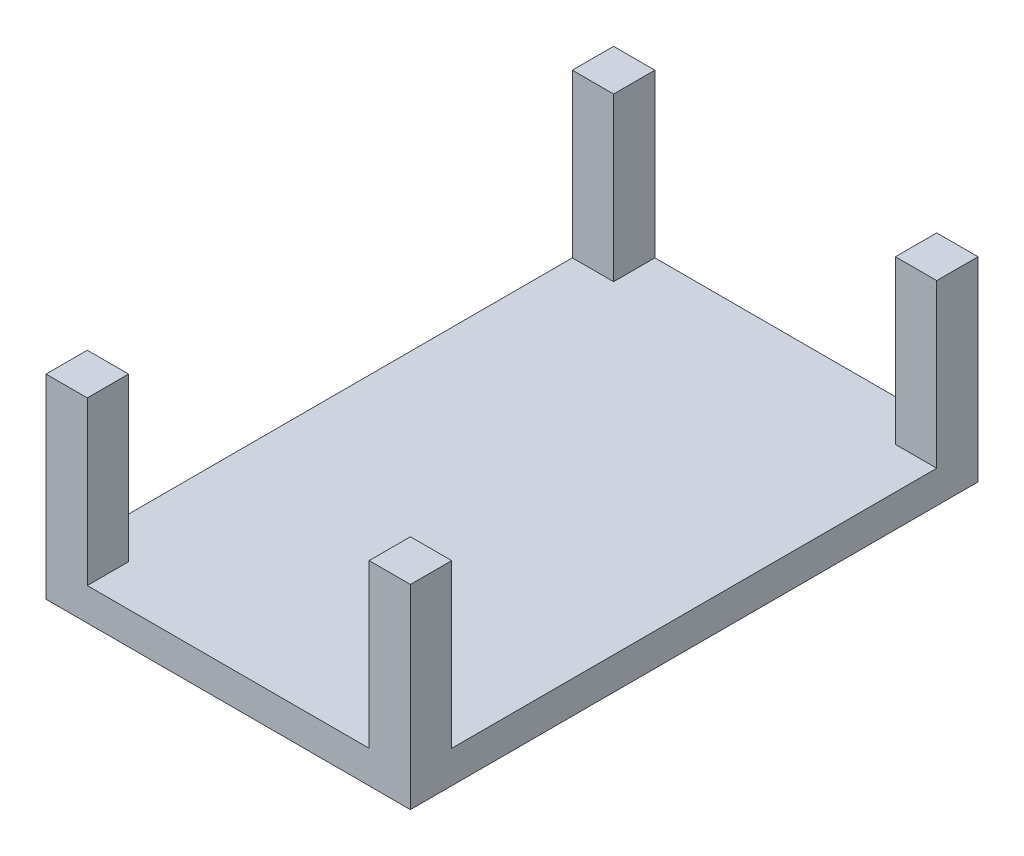
ISO-10303-21;
HEADER;
FILE_DESCRIPTION(('STEP AP214'),'2;1');
FILE_NAME('part.step','',(''),(''),'','','');
FILE_SCHEMA(('AUTOMOTIVE_DESIGN { 1 0 10303 214 1 1 1 1 }'));
ENDSEC;
DATA;
#1=APPLICATION_CONTEXT('core data for automotive mechanical design processes');
#2=APPLICATION_PROTOCOL_DEFINITION('international standard','automotive_design',2000,#1);
#3=PRODUCT_CONTEXT('',#1,'mechanical');
#4=PRODUCT('Part','Part','',(#3));
#5=PRODUCT_RELATED_PRODUCT_CATEGORY('part','',(#4));
#6=PRODUCT_DEFINITION_FORMATION('','',#4);
#7=PRODUCT_DEFINITION_CONTEXT('part definition',#1,'design');
#8=PRODUCT_DEFINITION('design','',#6,#7);
#9=PRODUCT_DEFINITION_SHAPE('','',#8);
#10=(LENGTH_UNIT() NAMED_UNIT(*) SI_UNIT(.MILLI.,.METRE.));
#11=(NAMED_UNIT(*) PLANE_ANGLE_UNIT() SI_UNIT($,.RADIAN.));
#12=(NAMED_UNIT(*) SI_UNIT($,.STERADIAN.) SOLID_ANGLE_UNIT());
#13=UNCERTAINTY_MEASURE_WITH_UNIT(LENGTH_MEASURE(1.E-05),#10,'distance_accuracy_value','');
#14=(GEOMETRIC_REPRESENTATION_CONTEXT(3) GLOBAL_UNCERTAINTY_ASSIGNED_CONTEXT((#13)) GLOBAL_UNIT_ASSIGNED_CONTEXT((#10,
#11,#12)) REPRESENTATION_CONTEXT('',''));
#15=CARTESIAN_POINT('',(0.,0.,0.));
#16=DIRECTION('',(0.,0.,1.));
#17=DIRECTION('',(1.,0.,0.));
#18=AXIS2_PLACEMENT_3D('',#15,#16,#17);
#19=CARTESIAN_POINT('',(0.,-200.,0.));
#20=DIRECTION('',(0.,-1.,0.));
#21=DIRECTION('',(0.,0.,-1.));
#22=AXIS2_PLACEMENT_3D('',#19,#20,#21);
#23=PLANE('',#22);
#24=DIRECTION('',(-1.,0.,0.));
#25=VECTOR('',#24,1.);
#26=CARTESIAN_POINT('',(0.,-200.,298.4));
#27=LINE('',#26,#25);
#28=CARTESIAN_POINT('',(0.,-200.,298.4));
#29=VERTEX_POINT('',#28);
#30=CARTESIAN_POINT('',(-50.8,-200.,298.4));
#31=VERTEX_POINT('',#30);
#32=EDGE_CURVE('E160',#29,#31,#27,.T.);
#33=ORIENTED_EDGE('',*,*,#32,.F.);
#34=DIRECTION('',(0.,0.,-1.));
#35=VECTOR('',#34,1.);
#36=CARTESIAN_POINT('',(0.,-200.,0.));
#37=LINE('',#36,#35);
#38=CARTESIAN_POINT('',(0.,-200.,-298.4));
#39=VERTEX_POINT('',#38);
#40=EDGE_CURVE('E256',#29,#39,#37,.T.);
#41=ORIENTED_EDGE('',*,*,#40,.T.);
#42=DIRECTION('',(-1.,0.,0.));
#43=VECTOR('',#42,1.);
#44=CARTESIAN_POINT('',(3.26073376523766E-13,-200.,-298.4));
#45=LINE('',#44,#43);
#46=CARTESIAN_POINT('',(-50.8,-200.,-298.4));
#47=VERTEX_POINT('',#46);
#48=EDGE_CURVE('E222',#39,#47,#45,.T.);
#49=ORIENTED_EDGE('',*,*,#48,.T.);
#50=DIRECTION('',(0.,0.,1.));
#51=VECTOR('',#50,1.);
#52=CARTESIAN_POINT('',(-50.8000000000002,-200.,0.));
#53=LINE('',#52,#51);
#54=CARTESIAN_POINT('',(-50.8,-200.,-349.2));
#55=VERTEX_POINT('',#54);
#56=EDGE_CURVE('E214',#55,#47,#53,.T.);
#57=ORIENTED_EDGE('',*,*,#56,.F.);
#58=DIRECTION('',(1.,0.,0.));
#59=VECTOR('',#58,1.);
#60=CARTESIAN_POINT('',(0.,-200.,-349.2));
#61=LINE('',#60,#59);
#62=CARTESIAN_POINT('',(-397.6,-200.,-349.2));
#63=VERTEX_POINT('',#62);
#64=EDGE_CURVE('E259',#63,#55,#61,.T.);
#65=ORIENTED_EDGE('',*,*,#64,.F.);
#66=DIRECTION('',(0.,0.,1.));
#67=VECTOR('',#66,1.);
#68=CARTESIAN_POINT('',(-397.6,-200.,-4.34473104912365E-13));
#69=LINE('',#68,#67);
#70=CARTESIAN_POINT('',(-397.6,-200.,-298.4));
#71=VERTEX_POINT('',#70);
#72=EDGE_CURVE('E246',#63,#71,#69,.T.);
#73=ORIENTED_EDGE('',*,*,#72,.T.);
#74=DIRECTION('',(-1.,0.,0.));
#75=VECTOR('',#74,1.);
#76=CARTESIAN_POINT('',(0.,-200.,-298.4));
#77=LINE('',#76,#75);
#78=CARTESIAN_POINT('',(-448.4,-200.,-298.4));
#79=VERTEX_POINT('',#78);
#80=EDGE_CURVE('E11',#71,#79,#77,.T.);
#81=ORIENTED_EDGE('',*,*,#80,.T.);
#82=DIRECTION('',(0.,0.,1.));
#83=VECTOR('',#82,1.);
#84=CARTESIAN_POINT('',(-448.4,-200.,0.));
#85=LINE('',#84,#83);
#86=CARTESIAN_POINT('',(-448.4,-200.,298.4));
#87=VERTEX_POINT('',#86);
#88=EDGE_CURVE('E264',#79,#87,#85,.T.);
#89=ORIENTED_EDGE('',*,*,#88,.T.);
#90=DIRECTION('',(-1.,0.,0.));
#91=VECTOR('',#90,1.);
#92=CARTESIAN_POINT('',(-3.26073376523767E-13,-200.,298.4));
#93=LINE('',#92,#91);
#94=CARTESIAN_POINT('',(-397.6,-200.,298.4));
#95=VERTEX_POINT('',#94);
#96=EDGE_CURVE('E50',#95,#87,#93,.T.);
#97=ORIENTED_EDGE('',*,*,#96,.F.);
#98=DIRECTION('',(0.,0.,1.));
#99=VECTOR('',#98,1.);
#100=CARTESIAN_POINT('',(-397.6,-200.,0.));
#101=LINE('',#100,#99);
#102=CARTESIAN_POINT('',(-397.6,-200.,349.2));
#103=VERTEX_POINT('',#102);
#104=EDGE_CURVE('E288',#95,#103,#101,.T.);
#105=ORIENTED_EDGE('',*,*,#104,.T.);
#106=DIRECTION('',(1.,0.,0.));
#107=VECTOR('',#106,1.);
#108=CARTESIAN_POINT('',(0.,-200.,349.2));
#109=LINE('',#108,#107);
#110=CARTESIAN_POINT('',(-50.8,-200.,349.2));
#111=VERTEX_POINT('',#110);
#112=EDGE_CURVE('E267',#103,#111,#109,.T.);
#113=ORIENTED_EDGE('',*,*,#112,.T.);
#114=DIRECTION('',(0.,0.,-1.));
#115=VECTOR('',#114,1.);
#116=CARTESIAN_POINT('',(-50.8,-200.,0.));
#117=LINE('',#116,#115);
#118=EDGE_CURVE('E192',#111,#31,#117,.T.);
#119=ORIENTED_EDGE('',*,*,#118,.T.);
#120=EDGE_LOOP('',(#33,#41,#49,#57,#65,#73,#81,#89,#97,#105,#113,#119));
#121=FACE_BOUND('',#120,.T.);
#122=ADVANCED_FACE('F41',(#121),#23,.F.);
#123=CARTESIAN_POINT('',(-397.6,-240.,0.));
#124=DIRECTION('',(-1.,0.,0.));
#125=DIRECTION('',(0.,0.,1.));
#126=AXIS2_PLACEMENT_3D('',#123,#124,#125);
#127=PLANE('',#126);
#128=ORIENTED_EDGE('',*,*,#104,.F.);
#129=DIRECTION('',(0.,1.,0.));
#130=VECTOR('',#129,1.);
#131=CARTESIAN_POINT('',(-397.6,-240.,298.4));
#132=LINE('',#131,#130);
#133=CARTESIAN_POINT('',(-397.6,0.,298.4));
#134=VERTEX_POINT('',#133);
#135=EDGE_CURVE('E300',#95,#134,#132,.T.);
#136=ORIENTED_EDGE('',*,*,#135,.T.);
#137=DIRECTION('',(0.,0.,1.));
#138=VECTOR('',#137,1.);
#139=CARTESIAN_POINT('',(-397.6,0.,0.));
#140=LINE('',#139,#138);
#141=CARTESIAN_POINT('',(-397.6,0.,349.2));
#142=VERTEX_POINT('',#141);
#143=EDGE_CURVE('E292',#134,#142,#140,.T.);
#144=ORIENTED_EDGE('',*,*,#143,.T.);
#145=DIRECTION('',(0.,1.,0.));
#146=VECTOR('',#145,1.);
#147=CARTESIAN_POINT('',(-397.6,-240.,349.2));
#148=LINE('',#147,#146);
#149=EDGE_CURVE('E315',#103,#142,#148,.T.);
#150=ORIENTED_EDGE('',*,*,#149,.F.);
#151=EDGE_LOOP('',(#128,#136,#144,#150));
#152=FACE_BOUND('',#151,.T.);
#153=ADVANCED_FACE('F43',(#152),#127,.F.);
#154=CARTESIAN_POINT('',(-3.26073376523767E-13,-240.,298.4));
#155=DIRECTION('',(0.,0.,-1.));
#156=DIRECTION('',(-1.,0.,0.));
#157=AXIS2_PLACEMENT_3D('',#154,#155,#156);
#158=PLANE('',#157);
#159=ORIENTED_EDGE('',*,*,#135,.F.);
#160=ORIENTED_EDGE('',*,*,#96,.T.);
#161=DIRECTION('',(0.,1.,0.));
#162=VECTOR('',#161,1.);
#163=CARTESIAN_POINT('',(-448.4,-240.,298.4));
#164=LINE('',#163,#162);
#165=CARTESIAN_POINT('',(-448.4,0.,298.4));
#166=VERTEX_POINT('',#165);
#167=EDGE_CURVE('E321',#87,#166,#164,.T.);
#168=ORIENTED_EDGE('',*,*,#167,.T.);
#169=DIRECTION('',(-1.,0.,0.));
#170=VECTOR('',#169,1.);
#171=CARTESIAN_POINT('',(-3.26073376523767E-13,0.,298.4));
#172=LINE('',#171,#170);
#173=EDGE_CURVE('E304',#134,#166,#172,.T.);
#174=ORIENTED_EDGE('',*,*,#173,.F.);
#175=EDGE_LOOP('',(#159,#160,#168,#174));
#176=FACE_BOUND('',#175,.T.);
#177=ADVANCED_FACE('F331',(#176),#158,.T.);
#178=CARTESIAN_POINT('',(0.,-240.,349.2));
#179=DIRECTION('',(0.,0.,1.));
#180=DIRECTION('',(1.,0.,0.));
#181=AXIS2_PLACEMENT_3D('',#178,#179,#180);
#182=PLANE('',#181);
#183=DIRECTION('',(1.,0.,0.));
#184=VECTOR('',#183,1.);
#185=CARTESIAN_POINT('',(0.,-240.,349.2));
#186=LINE('',#185,#184);
#187=CARTESIAN_POINT('',(-448.4,-240.,349.2));
#188=VERTEX_POINT('',#187);
#189=CARTESIAN_POINT('',(0.,-240.,349.2));
#190=VERTEX_POINT('',#189);
#191=EDGE_CURVE('E296',#188,#190,#186,.T.);
#192=ORIENTED_EDGE('',*,*,#191,.T.);
#193=DIRECTION('',(0.,-1.,0.));
#194=VECTOR('',#193,1.);
#195=CARTESIAN_POINT('',(0.,-200.,349.2));
#196=LINE('',#195,#194);
#197=CARTESIAN_POINT('',(0.,0.,349.2));
#198=VERTEX_POINT('',#197);
#199=EDGE_CURVE('E271',#198,#190,#196,.T.);
#200=ORIENTED_EDGE('',*,*,#199,.F.);
#201=DIRECTION('',(1.,0.,0.));
#202=VECTOR('',#201,1.);
#203=CARTESIAN_POINT('',(0.,0.,349.2));
#204=LINE('',#203,#202);
#205=CARTESIAN_POINT('',(-50.8,0.,349.2));
#206=VERTEX_POINT('',#205);
#207=EDGE_CURVE('E178',#206,#198,#204,.T.);
#208=ORIENTED_EDGE('',*,*,#207,.F.);
#209=DIRECTION('',(0.,1.,0.));
#210=VECTOR('',#209,1.);
#211=CARTESIAN_POINT('',(-50.8,-240.,349.2));
#212=LINE('',#211,#210);
#213=EDGE_CURVE('E163',#111,#206,#212,.T.);
#214=ORIENTED_EDGE('',*,*,#213,.F.);
#215=ORIENTED_EDGE('',*,*,#112,.F.);
#216=ORIENTED_EDGE('',*,*,#149,.T.);
#217=DIRECTION('',(1.,0.,0.));
#218=VECTOR('',#217,1.);
#219=CARTESIAN_POINT('',(0.,0.,349.2));
#220=LINE('',#219,#218);
#221=CARTESIAN_POINT('',(-448.4,0.,349.2));
#222=VERTEX_POINT('',#221);
#223=EDGE_CURVE('E297',#222,#142,#220,.T.);
#224=ORIENTED_EDGE('',*,*,#223,.F.);
#225=DIRECTION('',(0.,1.,0.));
#226=VECTOR('',#225,1.);
#227=CARTESIAN_POINT('',(-448.4,-240.,349.2));
#228=LINE('',#227,#226);
#229=EDGE_CURVE('E318',#188,#222,#228,.T.);
#230=ORIENTED_EDGE('',*,*,#229,.F.);
#231=EDGE_LOOP('',(#192,#200,#208,#214,#215,#216,#224,#230));
#232=FACE_BOUND('',#231,.T.);
#233=ADVANCED_FACE('F346',(#232),#182,.T.);
#234=CARTESIAN_POINT('',(-448.4,-240.,0.));
#235=DIRECTION('',(-1.,0.,0.));
#236=DIRECTION('',(0.,0.,1.));
#237=AXIS2_PLACEMENT_3D('',#234,#235,#236);
#238=PLANE('',#237);
#239=ORIENTED_EDGE('',*,*,#88,.F.);
#240=DIRECTION('',(0.,1.,0.));
#241=VECTOR('',#240,1.);
#242=CARTESIAN_POINT('',(-448.4,-240.,-298.4));
#243=LINE('',#242,#241);
#244=CARTESIAN_POINT('',(-448.4,0.,-298.4));
#245=VERTEX_POINT('',#244);
#246=EDGE_CURVE('E242',#79,#245,#243,.T.);
#247=ORIENTED_EDGE('',*,*,#246,.T.);
#248=DIRECTION('',(0.,0.,1.));
#249=VECTOR('',#248,1.);
#250=CARTESIAN_POINT('',(-448.4,0.,0.));
#251=LINE('',#250,#249);
#252=CARTESIAN_POINT('',(-448.4,0.,-349.2));
#253=VERTEX_POINT('',#252);
#254=EDGE_CURVE('E226',#253,#245,#251,.T.);
#255=ORIENTED_EDGE('',*,*,#254,.F.);
#256=DIRECTION('',(0.,-1.,0.));
#257=VECTOR('',#256,1.);
#258=CARTESIAN_POINT('',(-448.4,-200.,-349.2));
#259=LINE('',#258,#257);
#260=CARTESIAN_POINT('',(-448.4,-240.,-349.2));
#261=VERTEX_POINT('',#260);
#262=EDGE_CURVE('E280',#253,#261,#259,.T.);
#263=ORIENTED_EDGE('',*,*,#262,.T.);
#264=DIRECTION('',(0.,0.,1.));
#265=VECTOR('',#264,1.);
#266=CARTESIAN_POINT('',(-448.4,-240.,0.));
#267=LINE('',#266,#265);
#268=EDGE_CURVE('E293',#261,#188,#267,.T.);
#269=ORIENTED_EDGE('',*,*,#268,.T.);
#270=ORIENTED_EDGE('',*,*,#229,.T.);
#271=DIRECTION('',(0.,0.,1.));
#272=VECTOR('',#271,1.);
#273=CARTESIAN_POINT('',(-448.4,0.,0.));
#274=LINE('',#273,#272);
#275=EDGE_CURVE('E308',#166,#222,#274,.T.);
#276=ORIENTED_EDGE('',*,*,#275,.F.);
#277=ORIENTED_EDGE('',*,*,#167,.F.);
#278=EDGE_LOOP('',(#239,#247,#255,#263,#269,#270,#276,#277));
#279=FACE_BOUND('',#278,.T.);
#280=ADVANCED_FACE('F337',(#279),#238,.T.);
#281=CARTESIAN_POINT('',(0.,-240.,0.));
#282=DIRECTION('',(0.,1.,0.));
#283=DIRECTION('',(0.,0.,1.));
#284=AXIS2_PLACEMENT_3D('',#281,#282,#283);
#285=PLANE('',#284);
#286=DIRECTION('',(1.,0.,0.));
#287=VECTOR('',#286,1.);
#288=CARTESIAN_POINT('',(0.,-240.,-349.2));
#289=LINE('',#288,#287);
#290=CARTESIAN_POINT('',(0.,-240.,-349.2));
#291=VERTEX_POINT('',#290);
#292=EDGE_CURVE('E260',#261,#291,#289,.T.);
#293=ORIENTED_EDGE('',*,*,#292,.T.);
#294=DIRECTION('',(0.,0.,-1.));
#295=VECTOR('',#294,1.);
#296=CARTESIAN_POINT('',(0.,-240.,0.));
#297=LINE('',#296,#295);
#298=EDGE_CURVE('E255',#190,#291,#297,.T.);
#299=ORIENTED_EDGE('',*,*,#298,.F.);
#300=ORIENTED_EDGE('',*,*,#191,.F.);
#301=ORIENTED_EDGE('',*,*,#268,.F.);
#302=EDGE_LOOP('',(#293,#299,#300,#301));
#303=FACE_BOUND('',#302,.T.);
#304=ADVANCED_FACE('F397',(#303),#285,.F.);
#305=CARTESIAN_POINT('',(0.,0.,0.));
#306=DIRECTION('',(0.,1.,0.));
#307=DIRECTION('',(0.,0.,1.));
#308=AXIS2_PLACEMENT_3D('',#305,#306,#307);
#309=PLANE('',#308);
#310=ORIENTED_EDGE('',*,*,#143,.F.);
#311=ORIENTED_EDGE('',*,*,#173,.T.);
#312=ORIENTED_EDGE('',*,*,#275,.T.);
#313=ORIENTED_EDGE('',*,*,#223,.T.);
#314=EDGE_LOOP('',(#310,#311,#312,#313));
#315=FACE_BOUND('',#314,.T.);
#316=ADVANCED_FACE('F342',(#315),#309,.T.);
#317=CARTESIAN_POINT('',(0.,-200.,0.));
#318=DIRECTION('',(-1.,0.,0.));
#319=DIRECTION('',(0.,0.,1.));
#320=AXIS2_PLACEMENT_3D('',#317,#318,#319);
#321=PLANE('',#320);
#322=ORIENTED_EDGE('',*,*,#298,.T.);
#323=DIRECTION('',(0.,-1.,0.));
#324=VECTOR('',#323,1.);
#325=CARTESIAN_POINT('',(0.,-200.,-349.2));
#326=LINE('',#325,#324);
#327=CARTESIAN_POINT('',(0.,0.,-349.2));
#328=VERTEX_POINT('',#327);
#329=EDGE_CURVE('E284',#328,#291,#326,.T.);
#330=ORIENTED_EDGE('',*,*,#329,.F.);
#331=DIRECTION('',(0.,0.,-1.));
#332=VECTOR('',#331,1.);
#333=CARTESIAN_POINT('',(0.,0.,0.));
#334=LINE('',#333,#332);
#335=CARTESIAN_POINT('',(0.,0.,-298.4));
#336=VERTEX_POINT('',#335);
#337=EDGE_CURVE('E203',#336,#328,#334,.T.);
#338=ORIENTED_EDGE('',*,*,#337,.F.);
#339=DIRECTION('',(0.,1.,0.));
#340=VECTOR('',#339,1.);
#341=CARTESIAN_POINT('',(0.,-240.,-298.4));
#342=LINE('',#341,#340);
#343=EDGE_CURVE('E215',#39,#336,#342,.T.);
#344=ORIENTED_EDGE('',*,*,#343,.F.);
#345=ORIENTED_EDGE('',*,*,#40,.F.);
#346=DIRECTION('',(0.,1.,0.));
#347=VECTOR('',#346,1.);
#348=CARTESIAN_POINT('',(0.,-240.,298.4));
#349=LINE('',#348,#347);
#350=CARTESIAN_POINT('',(0.,0.,298.4));
#351=VERTEX_POINT('',#350);
#352=EDGE_CURVE('E185',#29,#351,#349,.T.);
#353=ORIENTED_EDGE('',*,*,#352,.T.);
#354=DIRECTION('',(0.,0.,-1.));
#355=VECTOR('',#354,1.);
#356=CARTESIAN_POINT('',(0.,0.,0.));
#357=LINE('',#356,#355);
#358=EDGE_CURVE('E164',#198,#351,#357,.T.);
#359=ORIENTED_EDGE('',*,*,#358,.F.);
#360=ORIENTED_EDGE('',*,*,#199,.T.);
#361=EDGE_LOOP('',(#322,#330,#338,#344,#345,#353,#359,#360));
#362=FACE_BOUND('',#361,.T.);
#363=ADVANCED_FACE('F348',(#362),#321,.F.);
#364=CARTESIAN_POINT('',(0.,-200.,-349.2));
#365=DIRECTION('',(0.,0.,-1.));
#366=DIRECTION('',(-1.,0.,0.));
#367=AXIS2_PLACEMENT_3D('',#364,#365,#366);
#368=PLANE('',#367);
#369=ORIENTED_EDGE('',*,*,#329,.T.);
#370=ORIENTED_EDGE('',*,*,#292,.F.);
#371=ORIENTED_EDGE('',*,*,#262,.F.);
#372=DIRECTION('',(1.,0.,0.));
#373=VECTOR('',#372,1.);
#374=CARTESIAN_POINT('',(0.,0.,-349.2));
#375=LINE('',#374,#373);
#376=CARTESIAN_POINT('',(-397.6,0.,-349.2));
#377=VERTEX_POINT('',#376);
#378=EDGE_CURVE('E238',#253,#377,#375,.T.);
#379=ORIENTED_EDGE('',*,*,#378,.T.);
#380=DIRECTION('',(0.,1.,0.));
#381=VECTOR('',#380,1.);
#382=CARTESIAN_POINT('',(-397.6,-240.,-349.2));
#383=LINE('',#382,#381);
#384=EDGE_CURVE('E243',#63,#377,#383,.T.);
#385=ORIENTED_EDGE('',*,*,#384,.F.);
#386=ORIENTED_EDGE('',*,*,#64,.T.);
#387=DIRECTION('',(0.,1.,0.));
#388=VECTOR('',#387,1.);
#389=CARTESIAN_POINT('',(-50.8,-240.,-349.2));
#390=LINE('',#389,#388);
#391=CARTESIAN_POINT('',(-50.8,0.,-349.2));
#392=VERTEX_POINT('',#391);
#393=EDGE_CURVE('E211',#55,#392,#390,.T.);
#394=ORIENTED_EDGE('',*,*,#393,.T.);
#395=DIRECTION('',(1.,0.,0.));
#396=VECTOR('',#395,1.);
#397=CARTESIAN_POINT('',(0.,0.,-349.2));
#398=LINE('',#397,#396);
#399=EDGE_CURVE('E207',#392,#328,#398,.T.);
#400=ORIENTED_EDGE('',*,*,#399,.T.);
#401=EDGE_LOOP('',(#369,#370,#371,#379,#385,#386,#394,#400));
#402=FACE_BOUND('',#401,.T.);
#403=ADVANCED_FACE('F364',(#402),#368,.T.);
#404=CARTESIAN_POINT('',(0.,-240.,-298.4));
#405=DIRECTION('',(0.,0.,1.));
#406=DIRECTION('',(1.,0.,0.));
#407=AXIS2_PLACEMENT_3D('',#404,#405,#406);
#408=PLANE('',#407);
#409=ORIENTED_EDGE('',*,*,#80,.F.);
#410=DIRECTION('',(0.,1.,0.));
#411=VECTOR('',#410,1.);
#412=CARTESIAN_POINT('',(-397.6,-240.,-298.4));
#413=LINE('',#412,#411);
#414=CARTESIAN_POINT('',(-397.6,0.,-298.4));
#415=VERTEX_POINT('',#414);
#416=EDGE_CURVE('E247',#71,#415,#413,.T.);
#417=ORIENTED_EDGE('',*,*,#416,.T.);
#418=DIRECTION('',(1.,0.,0.));
#419=VECTOR('',#418,1.);
#420=CARTESIAN_POINT('',(0.,0.,-298.4));
#421=LINE('',#420,#419);
#422=EDGE_CURVE('E230',#245,#415,#421,.T.);
#423=ORIENTED_EDGE('',*,*,#422,.F.);
#424=ORIENTED_EDGE('',*,*,#246,.F.);
#425=EDGE_LOOP('',(#409,#417,#423,#424));
#426=FACE_BOUND('',#425,.T.);
#427=ADVANCED_FACE('F371',(#426),#408,.T.);
#428=CARTESIAN_POINT('',(-397.6,-240.,-4.34473104912365E-13));
#429=DIRECTION('',(1.,0.,0.));
#430=DIRECTION('',(0.,0.,-1.));
#431=AXIS2_PLACEMENT_3D('',#428,#429,#430);
#432=PLANE('',#431);
#433=ORIENTED_EDGE('',*,*,#72,.F.);
#434=ORIENTED_EDGE('',*,*,#384,.T.);
#435=DIRECTION('',(0.,0.,-1.));
#436=VECTOR('',#435,1.);
#437=CARTESIAN_POINT('',(-397.6,0.,-4.34473104912365E-13));
#438=LINE('',#437,#436);
#439=EDGE_CURVE('E234',#415,#377,#438,.T.);
#440=ORIENTED_EDGE('',*,*,#439,.F.);
#441=ORIENTED_EDGE('',*,*,#416,.F.);
#442=EDGE_LOOP('',(#433,#434,#440,#441));
#443=FACE_BOUND('',#442,.T.);
#444=ADVANCED_FACE('F368',(#443),#432,.T.);
#445=CARTESIAN_POINT('',(0.,0.,0.));
#446=DIRECTION('',(0.,1.,0.));
#447=DIRECTION('',(0.,0.,1.));
#448=AXIS2_PLACEMENT_3D('',#445,#446,#447);
#449=PLANE('',#448);
#450=ORIENTED_EDGE('',*,*,#254,.T.);
#451=ORIENTED_EDGE('',*,*,#422,.T.);
#452=ORIENTED_EDGE('',*,*,#439,.T.);
#453=ORIENTED_EDGE('',*,*,#378,.F.);
#454=EDGE_LOOP('',(#450,#451,#452,#453));
#455=FACE_BOUND('',#454,.T.);
#456=ADVANCED_FACE('F376',(#455),#449,.T.);
#457=CARTESIAN_POINT('',(3.26073376523766E-13,-240.,-298.4));
#458=DIRECTION('',(0.,0.,1.));
#459=DIRECTION('',(1.,0.,0.));
#460=AXIS2_PLACEMENT_3D('',#457,#458,#459);
#461=PLANE('',#460);
#462=ORIENTED_EDGE('',*,*,#48,.F.);
#463=ORIENTED_EDGE('',*,*,#343,.T.);
#464=DIRECTION('',(1.,0.,0.));
#465=VECTOR('',#464,1.);
#466=CARTESIAN_POINT('',(3.26073376523766E-13,0.,-298.4));
#467=LINE('',#466,#465);
#468=CARTESIAN_POINT('',(-50.8,0.,-298.4));
#469=VERTEX_POINT('',#468);
#470=EDGE_CURVE('E199',#469,#336,#467,.T.);
#471=ORIENTED_EDGE('',*,*,#470,.F.);
#472=DIRECTION('',(0.,1.,0.));
#473=VECTOR('',#472,1.);
#474=CARTESIAN_POINT('',(-50.8,-240.,-298.4));
#475=LINE('',#474,#473);
#476=EDGE_CURVE('E65',#47,#469,#475,.T.);
#477=ORIENTED_EDGE('',*,*,#476,.F.);
#478=EDGE_LOOP('',(#462,#463,#471,#477));
#479=FACE_BOUND('',#478,.T.);
#480=ADVANCED_FACE('F353',(#479),#461,.T.);
#481=CARTESIAN_POINT('',(-50.8000000000002,-240.,0.));
#482=DIRECTION('',(1.,0.,0.));
#483=DIRECTION('',(0.,0.,-1.));
#484=AXIS2_PLACEMENT_3D('',#481,#482,#483);
#485=PLANE('',#484);
#486=ORIENTED_EDGE('',*,*,#393,.F.);
#487=ORIENTED_EDGE('',*,*,#56,.T.);
#488=ORIENTED_EDGE('',*,*,#476,.T.);
#489=DIRECTION('',(0.,0.,-1.));
#490=VECTOR('',#489,1.);
#491=CARTESIAN_POINT('',(-50.8000000000002,0.,0.));
#492=LINE('',#491,#490);
#493=EDGE_CURVE('E195',#469,#392,#492,.T.);
#494=ORIENTED_EDGE('',*,*,#493,.T.);
#495=EDGE_LOOP('',(#486,#487,#488,#494));
#496=FACE_BOUND('',#495,.T.);
#497=ADVANCED_FACE('F360',(#496),#485,.F.);
#498=CARTESIAN_POINT('',(0.,0.,0.));
#499=DIRECTION('',(0.,1.,0.));
#500=DIRECTION('',(0.,0.,1.));
#501=AXIS2_PLACEMENT_3D('',#498,#499,#500);
#502=PLANE('',#501);
#503=ORIENTED_EDGE('',*,*,#493,.F.);
#504=ORIENTED_EDGE('',*,*,#470,.T.);
#505=ORIENTED_EDGE('',*,*,#337,.T.);
#506=ORIENTED_EDGE('',*,*,#399,.F.);
#507=EDGE_LOOP('',(#503,#504,#505,#506));
#508=FACE_BOUND('',#507,.T.);
#509=ADVANCED_FACE('F358',(#508),#502,.T.);
#510=CARTESIAN_POINT('',(-50.8,-240.,0.));
#511=DIRECTION('',(-1.,0.,0.));
#512=DIRECTION('',(0.,0.,1.));
#513=AXIS2_PLACEMENT_3D('',#510,#511,#512);
#514=PLANE('',#513);
#515=ORIENTED_EDGE('',*,*,#118,.F.);
#516=ORIENTED_EDGE('',*,*,#213,.T.);
#517=DIRECTION('',(0.,0.,1.));
#518=VECTOR('',#517,1.);
#519=CARTESIAN_POINT('',(-50.8,0.,0.));
#520=LINE('',#519,#518);
#521=CARTESIAN_POINT('',(-50.8,0.,298.4));
#522=VERTEX_POINT('',#521);
#523=EDGE_CURVE('E170',#522,#206,#520,.T.);
#524=ORIENTED_EDGE('',*,*,#523,.F.);
#525=DIRECTION('',(0.,1.,0.));
#526=VECTOR('',#525,1.);
#527=CARTESIAN_POINT('',(-50.8,-240.,298.4));
#528=LINE('',#527,#526);
#529=EDGE_CURVE('E57',#31,#522,#528,.T.);
#530=ORIENTED_EDGE('',*,*,#529,.F.);
#531=EDGE_LOOP('',(#515,#516,#524,#530));
#532=FACE_BOUND('',#531,.T.);
#533=ADVANCED_FACE('F174',(#532),#514,.T.);
#534=CARTESIAN_POINT('',(0.,-240.,298.4));
#535=DIRECTION('',(0.,0.,1.));
#536=DIRECTION('',(1.,0.,0.));
#537=AXIS2_PLACEMENT_3D('',#534,#535,#536);
#538=PLANE('',#537);
#539=ORIENTED_EDGE('',*,*,#352,.F.);
#540=ORIENTED_EDGE('',*,*,#32,.T.);
#541=ORIENTED_EDGE('',*,*,#529,.T.);
#542=DIRECTION('',(1.,0.,0.));
#543=VECTOR('',#542,1.);
#544=CARTESIAN_POINT('',(0.,0.,298.4));
#545=LINE('',#544,#543);
#546=EDGE_CURVE('E157',#522,#351,#545,.T.);
#547=ORIENTED_EDGE('',*,*,#546,.T.);
#548=EDGE_LOOP('',(#539,#540,#541,#547));
#549=FACE_BOUND('',#548,.T.);
#550=ADVANCED_FACE('F156',(#549),#538,.F.);
#551=CARTESIAN_POINT('',(0.,0.,0.));
#552=DIRECTION('',(0.,1.,0.));
#553=DIRECTION('',(0.,0.,1.));
#554=AXIS2_PLACEMENT_3D('',#551,#552,#553);
#555=PLANE('',#554);
#556=ORIENTED_EDGE('',*,*,#546,.F.);
#557=ORIENTED_EDGE('',*,*,#523,.T.);
#558=ORIENTED_EDGE('',*,*,#207,.T.);
#559=ORIENTED_EDGE('',*,*,#358,.T.);
#560=EDGE_LOOP('',(#556,#557,#558,#559));
#561=FACE_BOUND('',#560,.T.);
#562=ADVANCED_FACE('F168',(#561),#555,.T.);
#563=CLOSED_SHELL('',(#122,#153,#177,#233,#280,#304,#316,#363,#403,#427,#444,#456,#480,#497,
#509,#533,#550,#562));
#564=MANIFOLD_SOLID_BREP('B2',#563);
#565=ADVANCED_BREP_SHAPE_REPRESENTATION('',(#18,#564),#14);
#566=SHAPE_DEFINITION_REPRESENTATION(#9,#565);
ENDSEC;
END-ISO-10303-21;
